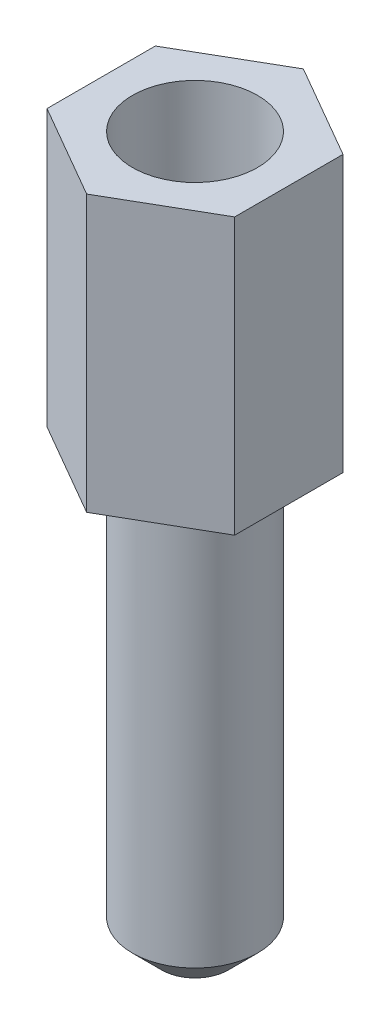
ISO-10303-21;
HEADER;
FILE_DESCRIPTION(('STEP AP214'),'2;1');
FILE_NAME('part.step','',(''),(''),'','','');
FILE_SCHEMA(('AUTOMOTIVE_DESIGN { 1 0 10303 214 1 1 1 1 }'));
ENDSEC;
DATA;
#1=APPLICATION_CONTEXT('core data for automotive mechanical design processes');
#2=APPLICATION_PROTOCOL_DEFINITION('international standard','automotive_design',2000,#1);
#3=PRODUCT_CONTEXT('',#1,'mechanical');
#4=PRODUCT('Part','Part','',(#3));
#5=PRODUCT_RELATED_PRODUCT_CATEGORY('part','',(#4));
#6=PRODUCT_DEFINITION_FORMATION('','',#4);
#7=PRODUCT_DEFINITION_CONTEXT('part definition',#1,'design');
#8=PRODUCT_DEFINITION('design','',#6,#7);
#9=PRODUCT_DEFINITION_SHAPE('','',#8);
#10=(LENGTH_UNIT() NAMED_UNIT(*) SI_UNIT(.MILLI.,.METRE.));
#11=(NAMED_UNIT(*) PLANE_ANGLE_UNIT() SI_UNIT($,.RADIAN.));
#12=(NAMED_UNIT(*) SI_UNIT($,.STERADIAN.) SOLID_ANGLE_UNIT());
#13=UNCERTAINTY_MEASURE_WITH_UNIT(LENGTH_MEASURE(1.E-05),#10,'distance_accuracy_value','');
#14=(GEOMETRIC_REPRESENTATION_CONTEXT(3) GLOBAL_UNCERTAINTY_ASSIGNED_CONTEXT((#13)) GLOBAL_UNIT_ASSIGNED_CONTEXT((#10,
#11,#12)) REPRESENTATION_CONTEXT('',''));
#15=CARTESIAN_POINT('',(0.,0.,0.));
#16=DIRECTION('',(0.,0.,1.));
#17=DIRECTION('',(1.,0.,0.));
#18=AXIS2_PLACEMENT_3D('',#15,#16,#17);
#19=CARTESIAN_POINT('',(0.,2.16591726717752,0.));
#20=DIRECTION('',(0.,1.,0.));
#21=DIRECTION('',(0.,0.,1.));
#22=AXIS2_PLACEMENT_3D('',#19,#20,#21);
#23=CONICAL_SURFACE('',#22,1.06679999999075,1.0471975511087);
#24=CARTESIAN_POINT('',(0.,1.54999999995198,-1.13686837721616E-10));
#25=VERTEX_POINT('',#24);
#26=VERTEX_LOOP('',#25);
#27=FACE_BOUND('',#26,.T.);
#28=CARTESIAN_POINT('',(0.,2.16591726717,0.));
#29=DIRECTION('',(0.,-1.,0.));
#30=DIRECTION('',(0.,0.,-1.));
#31=AXIS2_PLACEMENT_3D('',#28,#29,#30);
#32=CIRCLE('',#31,1.0668);
#33=CARTESIAN_POINT('',(0.,2.16591726717,-1.0668));
#34=VERTEX_POINT('',#33);
#35=EDGE_CURVE('E79',#34,#34,#32,.F.);
#36=ORIENTED_EDGE('',*,*,#35,.T.);
#37=EDGE_LOOP('',(#36));
#38=FACE_BOUND('',#37,.T.);
#39=ADVANCED_FACE('F17',(#27,#38),#23,.F.);
#40=CARTESIAN_POINT('',(0.,0.,0.));
#41=DIRECTION('',(0.,-1.,0.));
#42=DIRECTION('',(0.,0.,-1.));
#43=AXIS2_PLACEMENT_3D('',#40,#41,#42);
#44=CYLINDRICAL_SURFACE('',#43,1.0668);
#45=CARTESIAN_POINT('',(0.,6.05,0.));
#46=DIRECTION('',(0.,-1.,0.));
#47=DIRECTION('',(0.,0.,-1.));
#48=AXIS2_PLACEMENT_3D('',#45,#46,#47);
#49=CIRCLE('',#48,1.0668);
#50=CARTESIAN_POINT('',(0.,6.05,-1.0668));
#51=VERTEX_POINT('',#50);
#52=EDGE_CURVE('E20',#51,#51,#49,.F.);
#53=ORIENTED_EDGE('',*,*,#52,.T.);
#54=EDGE_LOOP('',(#53));
#55=FACE_BOUND('',#54,.T.);
#56=ORIENTED_EDGE('',*,*,#35,.F.);
#57=EDGE_LOOP('',(#56));
#58=FACE_BOUND('',#57,.T.);
#59=ADVANCED_FACE('F76',(#55,#58),#44,.F.);
#60=CARTESIAN_POINT('',(0.,6.05,5.));
#61=DIRECTION('',(0.,-1.,0.));
#62=DIRECTION('',(0.,0.,-1.));
#63=AXIS2_PLACEMENT_3D('',#60,#61,#62);
#64=PLANE('',#63);
#65=ORIENTED_EDGE('',*,*,#52,.F.);
#66=EDGE_LOOP('',(#65));
#67=FACE_BOUND('',#66,.T.);
#68=DIRECTION('',(-0.866025403784329,0.,-0.50000000000019));
#69=VECTOR('',#68,1.);
#70=CARTESIAN_POINT('',(-1.6,6.05,0.923760430703));
#71=LINE('',#70,#69);
#72=CARTESIAN_POINT('',(-1.6,6.05,0.923760430703));
#73=VERTEX_POINT('',#72);
#74=CARTESIAN_POINT('',(3.38291276910418E-13,6.05,1.84752086140941));
#75=VERTEX_POINT('',#74);
#76=EDGE_CURVE('E117',#73,#75,#71,.F.);
#77=ORIENTED_EDGE('',*,*,#76,.T.);
#78=DIRECTION('',(-0.866025403784329,0.,0.50000000000019));
#79=VECTOR('',#78,1.);
#80=CARTESIAN_POINT('',(0.,6.05,1.84752086141));
#81=LINE('',#80,#79);
#82=CARTESIAN_POINT('',(1.60000000000034,6.05,0.923760430703586));
#83=VERTEX_POINT('',#82);
#84=EDGE_CURVE('E124',#75,#83,#81,.F.);
#85=ORIENTED_EDGE('',*,*,#84,.T.);
#86=DIRECTION('',(0.,0.,1.));
#87=VECTOR('',#86,1.);
#88=CARTESIAN_POINT('',(1.6,6.05,0.923760430703));
#89=LINE('',#88,#87);
#90=CARTESIAN_POINT('',(1.6,6.05,-0.923760430703));
#91=VERTEX_POINT('',#90);
#92=EDGE_CURVE('E128',#83,#91,#89,.F.);
#93=ORIENTED_EDGE('',*,*,#92,.T.);
#94=DIRECTION('',(0.866025403784329,0.,0.50000000000019));
#95=VECTOR('',#94,1.);
#96=CARTESIAN_POINT('',(1.6,6.05,-0.923760430703));
#97=LINE('',#96,#95);
#98=CARTESIAN_POINT('',(-3.39187184746309E-13,6.05,-1.84752086140941));
#99=VERTEX_POINT('',#98);
#100=EDGE_CURVE('E132',#91,#99,#97,.F.);
#101=ORIENTED_EDGE('',*,*,#100,.T.);
#102=DIRECTION('',(0.866025403784329,0.,-0.50000000000019));
#103=VECTOR('',#102,1.);
#104=CARTESIAN_POINT('',(0.,6.05,-1.84752086141));
#105=LINE('',#104,#103);
#106=CARTESIAN_POINT('',(-1.60000000000034,6.05,-0.923760430703587));
#107=VERTEX_POINT('',#106);
#108=EDGE_CURVE('E70',#99,#107,#105,.F.);
#109=ORIENTED_EDGE('',*,*,#108,.T.);
#110=DIRECTION('',(0.,0.,-1.));
#111=VECTOR('',#110,1.);
#112=CARTESIAN_POINT('',(-1.6,6.05,-0.923760430703));
#113=LINE('',#112,#111);
#114=EDGE_CURVE('E83',#107,#73,#113,.F.);
#115=ORIENTED_EDGE('',*,*,#114,.T.);
#116=EDGE_LOOP('',(#77,#85,#93,#101,#109,#115));
#117=FACE_BOUND('',#116,.T.);
#118=ADVANCED_FACE('F135',(#67,#117),#64,.F.);
#119=CARTESIAN_POINT('',(-1.6,6.05,-0.923760430703));
#120=DIRECTION('',(1.,0.,0.));
#121=DIRECTION('',(0.,0.,-1.));
#122=AXIS2_PLACEMENT_3D('',#119,#120,#121);
#123=PLANE('',#122);
#124=DIRECTION('',(0.,1.,0.));
#125=VECTOR('',#124,1.);
#126=CARTESIAN_POINT('',(-1.6,6.05,0.923760430703));
#127=LINE('',#126,#125);
#128=CARTESIAN_POINT('',(-1.6,1.35,0.923760430703));
#129=VERTEX_POINT('',#128);
#130=EDGE_CURVE('E119',#129,#73,#127,.T.);
#131=ORIENTED_EDGE('',*,*,#130,.T.);
#132=ORIENTED_EDGE('',*,*,#114,.F.);
#133=DIRECTION('',(0.,1.,0.));
#134=VECTOR('',#133,1.);
#135=CARTESIAN_POINT('',(-1.60000000000136,6.05,-0.923760430705348));
#136=LINE('',#135,#134);
#137=CARTESIAN_POINT('',(-1.60000000000034,1.35,-0.923760430703587));
#138=VERTEX_POINT('',#137);
#139=EDGE_CURVE('E134',#107,#138,#136,.F.);
#140=ORIENTED_EDGE('',*,*,#139,.T.);
#141=DIRECTION('',(0.,0.,-1.));
#142=VECTOR('',#141,1.);
#143=CARTESIAN_POINT('',(-1.6,1.35,1.0668));
#144=LINE('',#143,#142);
#145=EDGE_CURVE('E114',#129,#138,#144,.T.);
#146=ORIENTED_EDGE('',*,*,#145,.F.);
#147=EDGE_LOOP('',(#131,#132,#140,#146));
#148=FACE_BOUND('',#147,.T.);
#149=ADVANCED_FACE('F140',(#148),#123,.F.);
#150=CARTESIAN_POINT('',(0.,6.05,-1.84752086141));
#151=DIRECTION('',(0.50000000000019,0.,0.866025403784329));
#152=DIRECTION('',(0.866025403784329,0.,-0.50000000000019));
#153=AXIS2_PLACEMENT_3D('',#150,#151,#152);
#154=PLANE('',#153);
#155=ORIENTED_EDGE('',*,*,#139,.F.);
#156=ORIENTED_EDGE('',*,*,#108,.F.);
#157=DIRECTION('',(0.,1.,0.));
#158=VECTOR('',#157,1.);
#159=CARTESIAN_POINT('',(-1.35633691777937E-12,6.05,-1.84752086140765));
#160=LINE('',#159,#158);
#161=CARTESIAN_POINT('',(-3.39352452846212E-13,1.35,-1.84752086140941));
#162=VERTEX_POINT('',#161);
#163=EDGE_CURVE('E130',#99,#162,#160,.F.);
#164=ORIENTED_EDGE('',*,*,#163,.T.);
#165=DIRECTION('',(0.866025403783595,0.,-0.500000000001461));
#166=VECTOR('',#165,1.);
#167=CARTESIAN_POINT('',(-1.6,1.35,-0.923760430703));
#168=LINE('',#167,#166);
#169=EDGE_CURVE('E111',#138,#162,#168,.T.);
#170=ORIENTED_EDGE('',*,*,#169,.F.);
#171=EDGE_LOOP('',(#155,#156,#164,#170));
#172=FACE_BOUND('',#171,.T.);
#173=ADVANCED_FACE('F158',(#172),#154,.F.);
#174=CARTESIAN_POINT('',(1.6,6.05,-0.923760430703));
#175=DIRECTION('',(-0.50000000000019,0.,0.866025403784329));
#176=DIRECTION('',(0.866025403784329,0.,0.50000000000019));
#177=AXIS2_PLACEMENT_3D('',#174,#175,#176);
#178=PLANE('',#177);
#179=ORIENTED_EDGE('',*,*,#163,.F.);
#180=ORIENTED_EDGE('',*,*,#100,.F.);
#181=DIRECTION('',(0.,1.,0.));
#182=VECTOR('',#181,1.);
#183=CARTESIAN_POINT('',(1.6,6.05,-0.923760430703));
#184=LINE('',#183,#182);
#185=CARTESIAN_POINT('',(1.6,1.35,-0.923760430703));
#186=VERTEX_POINT('',#185);
#187=EDGE_CURVE('E126',#91,#186,#184,.F.);
#188=ORIENTED_EDGE('',*,*,#187,.T.);
#189=DIRECTION('',(0.866025403783595,0.,0.500000000001461));
#190=VECTOR('',#189,1.);
#191=CARTESIAN_POINT('',(0.,1.35,-1.84752086141));
#192=LINE('',#191,#190);
#193=EDGE_CURVE('E108',#162,#186,#192,.T.);
#194=ORIENTED_EDGE('',*,*,#193,.F.);
#195=EDGE_LOOP('',(#179,#180,#188,#194));
#196=FACE_BOUND('',#195,.T.);
#197=ADVANCED_FACE('F154',(#196),#178,.F.);
#198=CARTESIAN_POINT('',(1.6,6.05,0.923760430703));
#199=DIRECTION('',(-1.,0.,0.));
#200=DIRECTION('',(0.,0.,1.));
#201=AXIS2_PLACEMENT_3D('',#198,#199,#200);
#202=PLANE('',#201);
#203=ORIENTED_EDGE('',*,*,#187,.F.);
#204=ORIENTED_EDGE('',*,*,#92,.F.);
#205=DIRECTION('',(0.,1.,0.));
#206=VECTOR('',#205,1.);
#207=CARTESIAN_POINT('',(1.60000000000136,6.05,0.923760430705348));
#208=LINE('',#207,#206);
#209=CARTESIAN_POINT('',(1.60000000000034,1.35,0.923760430703587));
#210=VERTEX_POINT('',#209);
#211=EDGE_CURVE('E122',#83,#210,#208,.F.);
#212=ORIENTED_EDGE('',*,*,#211,.T.);
#213=DIRECTION('',(0.,0.,-1.));
#214=VECTOR('',#213,1.);
#215=CARTESIAN_POINT('',(1.6,1.35,1.0668));
#216=LINE('',#215,#214);
#217=EDGE_CURVE('E101',#186,#210,#216,.F.);
#218=ORIENTED_EDGE('',*,*,#217,.F.);
#219=EDGE_LOOP('',(#203,#204,#212,#218));
#220=FACE_BOUND('',#219,.T.);
#221=ADVANCED_FACE('F150',(#220),#202,.F.);
#222=CARTESIAN_POINT('',(0.,6.05,1.84752086141));
#223=DIRECTION('',(-0.50000000000019,0.,-0.866025403784329));
#224=DIRECTION('',(-0.866025403784329,0.,0.50000000000019));
#225=AXIS2_PLACEMENT_3D('',#222,#223,#224);
#226=PLANE('',#225);
#227=ORIENTED_EDGE('',*,*,#211,.F.);
#228=ORIENTED_EDGE('',*,*,#84,.F.);
#229=DIRECTION('',(0.,1.,0.));
#230=VECTOR('',#229,1.);
#231=CARTESIAN_POINT('',(1.35525271560688E-12,6.05,1.84752086140765));
#232=LINE('',#231,#230);
#233=CARTESIAN_POINT('',(3.38613724121709E-13,1.35,1.84752086140941));
#234=VERTEX_POINT('',#233);
#235=EDGE_CURVE('E35',#75,#234,#232,.F.);
#236=ORIENTED_EDGE('',*,*,#235,.T.);
#237=DIRECTION('',(-0.866025403783595,0.,0.500000000001461));
#238=VECTOR('',#237,1.);
#239=CARTESIAN_POINT('',(1.6,1.35,0.923760430703));
#240=LINE('',#239,#238);
#241=EDGE_CURVE('E96',#210,#234,#240,.T.);
#242=ORIENTED_EDGE('',*,*,#241,.F.);
#243=EDGE_LOOP('',(#227,#228,#236,#242));
#244=FACE_BOUND('',#243,.T.);
#245=ADVANCED_FACE('F146',(#244),#226,.F.);
#246=CARTESIAN_POINT('',(-1.6,6.05,0.923760430703));
#247=DIRECTION('',(0.50000000000019,0.,-0.866025403784329));
#248=DIRECTION('',(-0.866025403784329,0.,-0.50000000000019));
#249=AXIS2_PLACEMENT_3D('',#246,#247,#248);
#250=PLANE('',#249);
#251=ORIENTED_EDGE('',*,*,#235,.F.);
#252=ORIENTED_EDGE('',*,*,#76,.F.);
#253=ORIENTED_EDGE('',*,*,#130,.F.);
#254=DIRECTION('',(-0.866025403783595,0.,-0.500000000001461));
#255=VECTOR('',#254,1.);
#256=CARTESIAN_POINT('',(0.,1.35,1.84752086141));
#257=LINE('',#256,#255);
#258=EDGE_CURVE('E92',#234,#129,#257,.T.);
#259=ORIENTED_EDGE('',*,*,#258,.F.);
#260=EDGE_LOOP('',(#251,#252,#253,#259));
#261=FACE_BOUND('',#260,.T.);
#262=ADVANCED_FACE('F142',(#261),#250,.F.);
#263=CARTESIAN_POINT('',(0.,-6.05,0.));
#264=DIRECTION('',(0.,-1.,0.));
#265=DIRECTION('',(0.,0.,-1.));
#266=AXIS2_PLACEMENT_3D('',#263,#264,#265);
#267=PLANE('',#266);
#268=CARTESIAN_POINT('',(0.,-6.04999999995259,0.));
#269=DIRECTION('',(0.,1.,0.));
#270=DIRECTION('',(0.,0.,1.));
#271=AXIS2_PLACEMENT_3D('',#268,#269,#270);
#272=CIRCLE('',#271,0.566799999946765);
#273=CARTESIAN_POINT('',(0.,-6.04999999995259,0.566799999946765));
#274=VERTEX_POINT('',#273);
#275=EDGE_CURVE('E90',#274,#274,#272,.T.);
#276=ORIENTED_EDGE('',*,*,#275,.F.);
#277=EDGE_LOOP('',(#276));
#278=FACE_BOUND('',#277,.T.);
#279=ADVANCED_FACE('F181',(#278),#267,.T.);
#280=CARTESIAN_POINT('',(0.,1.35,1.0668));
#281=DIRECTION('',(0.,-1.,0.));
#282=DIRECTION('',(0.,0.,-1.));
#283=AXIS2_PLACEMENT_3D('',#280,#281,#282);
#284=PLANE('',#283);
#285=CARTESIAN_POINT('',(0.,1.35,0.));
#286=DIRECTION('',(0.,-1.,0.));
#287=DIRECTION('',(0.,0.,-1.));
#288=AXIS2_PLACEMENT_3D('',#285,#286,#287);
#289=CIRCLE('',#288,1.0668);
#290=CARTESIAN_POINT('',(0.,1.35,-1.0668));
#291=VERTEX_POINT('',#290);
#292=EDGE_CURVE('E26',#291,#291,#289,.T.);
#293=ORIENTED_EDGE('',*,*,#292,.F.);
#294=EDGE_LOOP('',(#293));
#295=FACE_BOUND('',#294,.T.);
#296=ORIENTED_EDGE('',*,*,#241,.T.);
#297=ORIENTED_EDGE('',*,*,#258,.T.);
#298=ORIENTED_EDGE('',*,*,#145,.T.);
#299=ORIENTED_EDGE('',*,*,#169,.T.);
#300=ORIENTED_EDGE('',*,*,#193,.T.);
#301=ORIENTED_EDGE('',*,*,#217,.T.);
#302=EDGE_LOOP('',(#296,#297,#298,#299,#300,#301));
#303=FACE_BOUND('',#302,.T.);
#304=ADVANCED_FACE('F143',(#295,#303),#284,.T.);
#305=CARTESIAN_POINT('',(0.,-5.55000000002792,0.));
#306=DIRECTION('',(0.,1.,0.));
#307=DIRECTION('',(0.,0.,1.));
#308=AXIS2_PLACEMENT_3D('',#305,#306,#307);
#309=CONICAL_SURFACE('',#308,1.06679999988636,0.785398163412378);
#310=ORIENTED_EDGE('',*,*,#275,.T.);
#311=EDGE_LOOP('',(#310));
#312=FACE_BOUND('',#311,.T.);
#313=CARTESIAN_POINT('',(0.,-5.55,0.));
#314=DIRECTION('',(0.,-1.,0.));
#315=DIRECTION('',(0.,0.,-1.));
#316=AXIS2_PLACEMENT_3D('',#313,#314,#315);
#317=CIRCLE('',#316,1.0668);
#318=CARTESIAN_POINT('',(0.,-5.55,-1.0668));
#319=VERTEX_POINT('',#318);
#320=EDGE_CURVE('E11',#319,#319,#317,.F.);
#321=ORIENTED_EDGE('',*,*,#320,.F.);
#322=EDGE_LOOP('',(#321));
#323=FACE_BOUND('',#322,.T.);
#324=ADVANCED_FACE('F170',(#312,#323),#309,.T.);
#325=CARTESIAN_POINT('',(0.,0.,0.));
#326=DIRECTION('',(0.,-1.,0.));
#327=DIRECTION('',(0.,0.,-1.));
#328=AXIS2_PLACEMENT_3D('',#325,#326,#327);
#329=CYLINDRICAL_SURFACE('',#328,1.0668);
#330=ORIENTED_EDGE('',*,*,#320,.T.);
#331=EDGE_LOOP('',(#330));
#332=FACE_BOUND('',#331,.T.);
#333=ORIENTED_EDGE('',*,*,#292,.T.);
#334=EDGE_LOOP('',(#333));
#335=FACE_BOUND('',#334,.T.);
#336=ADVANCED_FACE('F168',(#332,#335),#329,.T.);
#337=CLOSED_SHELL('',(#39,#59,#118,#149,#173,#197,#221,#245,#262,#279,#304,#324,#336));
#338=MANIFOLD_SOLID_BREP('B1',#337);
#339=ADVANCED_BREP_SHAPE_REPRESENTATION('',(#18,#338),#14);
#340=SHAPE_DEFINITION_REPRESENTATION(#9,#339);
ENDSEC;
END-ISO-10303-21;
